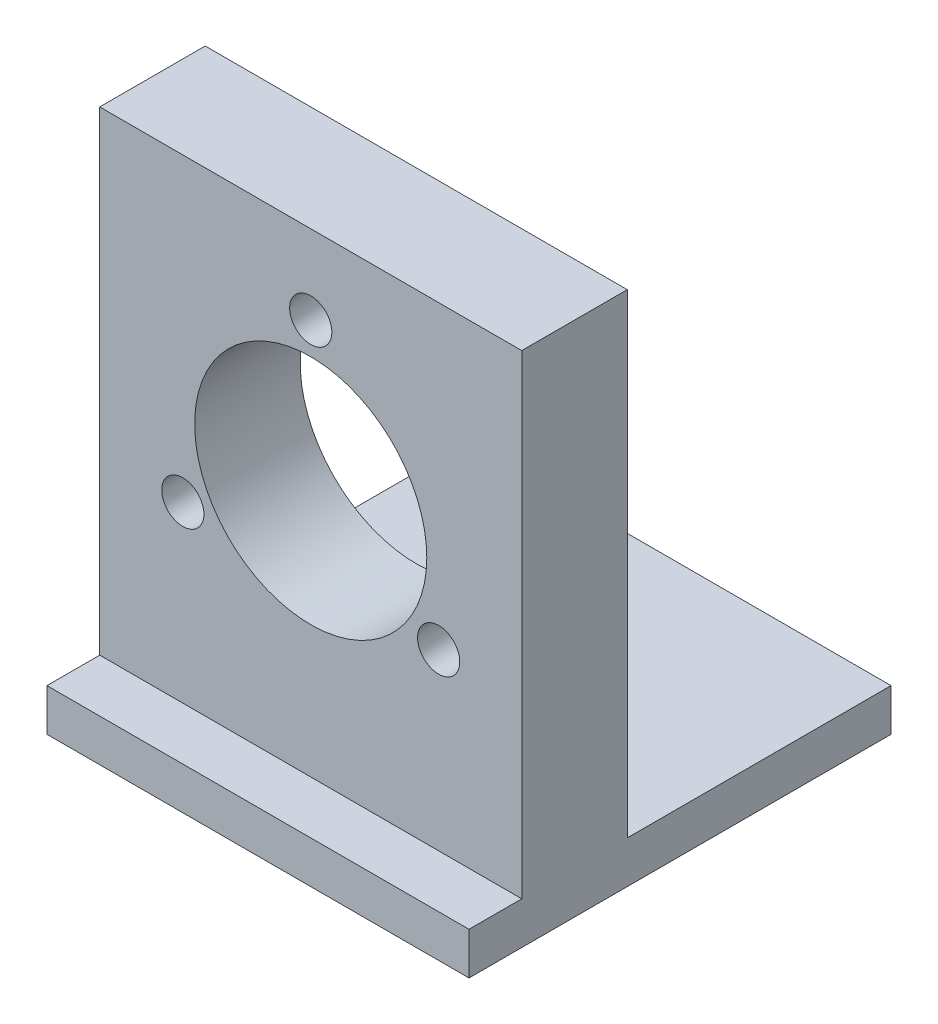
ISO-10303-21;
HEADER;
FILE_DESCRIPTION(('STEP AP214'),'2;1');
FILE_NAME('part.step','',(''),(''),'','','');
FILE_SCHEMA(('AUTOMOTIVE_DESIGN { 1 0 10303 214 1 1 1 1 }'));
ENDSEC;
DATA;
#1=APPLICATION_CONTEXT('core data for automotive mechanical design processes');
#2=APPLICATION_PROTOCOL_DEFINITION('international standard','automotive_design',2000,#1);
#3=PRODUCT_CONTEXT('',#1,'mechanical');
#4=PRODUCT('Part','Part','',(#3));
#5=PRODUCT_RELATED_PRODUCT_CATEGORY('part','',(#4));
#6=PRODUCT_DEFINITION_FORMATION('','',#4);
#7=PRODUCT_DEFINITION_CONTEXT('part definition',#1,'design');
#8=PRODUCT_DEFINITION('design','',#6,#7);
#9=PRODUCT_DEFINITION_SHAPE('','',#8);
#10=(LENGTH_UNIT() NAMED_UNIT(*) SI_UNIT(.MILLI.,.METRE.));
#11=(NAMED_UNIT(*) PLANE_ANGLE_UNIT() SI_UNIT($,.RADIAN.));
#12=(NAMED_UNIT(*) SI_UNIT($,.STERADIAN.) SOLID_ANGLE_UNIT());
#13=UNCERTAINTY_MEASURE_WITH_UNIT(LENGTH_MEASURE(1.E-05),#10,'distance_accuracy_value','');
#14=(GEOMETRIC_REPRESENTATION_CONTEXT(3) GLOBAL_UNCERTAINTY_ASSIGNED_CONTEXT((#13)) GLOBAL_UNIT_ASSIGNED_CONTEXT((#10,
#11,#12)) REPRESENTATION_CONTEXT('',''));
#15=CARTESIAN_POINT('',(0.,0.,0.));
#16=DIRECTION('',(0.,0.,1.));
#17=DIRECTION('',(1.,0.,0.));
#18=AXIS2_PLACEMENT_3D('',#15,#16,#17);
#19=CARTESIAN_POINT('',(0.,4.,0.));
#20=DIRECTION('',(0.,-1.,0.));
#21=DIRECTION('',(0.,0.,-1.));
#22=AXIS2_PLACEMENT_3D('',#19,#20,#21);
#23=PLANE('',#22);
#24=DIRECTION('',(-1.,0.,0.));
#25=VECTOR('',#24,1.);
#26=CARTESIAN_POINT('',(-12.2271510664455,4.,-0.794927437511903));
#27=LINE('',#26,#25);
#28=CARTESIAN_POINT('',(27.7728489335545,4.,-0.794927437511903));
#29=VERTEX_POINT('',#28);
#30=CARTESIAN_POINT('',(-12.2271510664455,4.,-0.794927437511903));
#31=VERTEX_POINT('',#30);
#32=EDGE_CURVE('E50',#29,#31,#27,.T.);
#33=ORIENTED_EDGE('',*,*,#32,.F.);
#34=DIRECTION('',(0.,0.,-1.));
#35=VECTOR('',#34,1.);
#36=CARTESIAN_POINT('',(27.7728489335545,4.,14.2050725624881));
#37=LINE('',#36,#35);
#38=CARTESIAN_POINT('',(27.7728489335545,4.,-25.7949274375119));
#39=VERTEX_POINT('',#38);
#40=EDGE_CURVE('E171',#29,#39,#37,.T.);
#41=ORIENTED_EDGE('',*,*,#40,.T.);
#42=DIRECTION('',(-1.,0.,0.));
#43=VECTOR('',#42,1.);
#44=CARTESIAN_POINT('',(-12.2271510664455,4.,-25.7949274375119));
#45=LINE('',#44,#43);
#46=CARTESIAN_POINT('',(-12.2271510664455,4.,-25.7949274375119));
#47=VERTEX_POINT('',#46);
#48=EDGE_CURVE('E161',#39,#47,#45,.T.);
#49=ORIENTED_EDGE('',*,*,#48,.T.);
#50=DIRECTION('',(0.,0.,1.));
#51=VECTOR('',#50,1.);
#52=CARTESIAN_POINT('',(-12.2271510664455,4.,14.2050725624881));
#53=LINE('',#52,#51);
#54=EDGE_CURVE('E151',#47,#31,#53,.T.);
#55=ORIENTED_EDGE('',*,*,#54,.T.);
#56=EDGE_LOOP('',(#33,#41,#49,#55));
#57=FACE_BOUND('',#56,.T.);
#58=ADVANCED_FACE('F33',(#57),#23,.F.);
#59=DIRECTION('',(1.,0.,0.));
#60=VECTOR('',#59,1.);
#61=CARTESIAN_POINT('',(-12.2271510664455,4.,9.2050725624881));
#62=LINE('',#61,#60);
#63=CARTESIAN_POINT('',(-12.2271510664455,4.,9.2050725624881));
#64=VERTEX_POINT('',#63);
#65=CARTESIAN_POINT('',(27.7728489335545,4.,9.2050725624881));
#66=VERTEX_POINT('',#65);
#67=EDGE_CURVE('E58',#64,#66,#62,.T.);
#68=ORIENTED_EDGE('',*,*,#67,.F.);
#69=CARTESIAN_POINT('',(-12.2271510664455,4.,14.2050725624881));
#70=VERTEX_POINT('',#69);
#71=EDGE_CURVE('E122',#64,#70,#53,.T.);
#72=ORIENTED_EDGE('',*,*,#71,.T.);
#73=DIRECTION('',(1.,0.,0.));
#74=VECTOR('',#73,1.);
#75=CARTESIAN_POINT('',(-12.2271510664455,4.,14.2050725624881));
#76=LINE('',#75,#74);
#77=CARTESIAN_POINT('',(27.7728489335545,4.,14.2050725624881));
#78=VERTEX_POINT('',#77);
#79=EDGE_CURVE('E145',#70,#78,#76,.T.);
#80=ORIENTED_EDGE('',*,*,#79,.T.);
#81=EDGE_CURVE('E167',#78,#66,#37,.T.);
#82=ORIENTED_EDGE('',*,*,#81,.T.);
#83=EDGE_LOOP('',(#68,#72,#80,#82));
#84=FACE_BOUND('',#83,.T.);
#85=ADVANCED_FACE('F177',(#84),#23,.F.);
#86=CARTESIAN_POINT('',(-12.2271510664455,4.,14.2050725624881));
#87=DIRECTION('',(1.,0.,0.));
#88=DIRECTION('',(0.,0.,-1.));
#89=AXIS2_PLACEMENT_3D('',#86,#87,#88);
#90=PLANE('',#89);
#91=DIRECTION('',(0.,0.,1.));
#92=VECTOR('',#91,1.);
#93=CARTESIAN_POINT('',(-12.2271510664455,0.,14.2050725624881));
#94=LINE('',#93,#92);
#95=CARTESIAN_POINT('',(-12.2271510664455,0.,-25.7949274375119));
#96=VERTEX_POINT('',#95);
#97=CARTESIAN_POINT('',(-12.2271510664455,0.,14.2050725624881));
#98=VERTEX_POINT('',#97);
#99=EDGE_CURVE('E123',#96,#98,#94,.T.);
#100=ORIENTED_EDGE('',*,*,#99,.T.);
#101=DIRECTION('',(0.,-1.,0.));
#102=VECTOR('',#101,1.);
#103=CARTESIAN_POINT('',(-12.2271510664455,4.,14.2050725624881));
#104=LINE('',#103,#102);
#105=EDGE_CURVE('E11',#70,#98,#104,.T.);
#106=ORIENTED_EDGE('',*,*,#105,.F.);
#107=ORIENTED_EDGE('',*,*,#71,.F.);
#108=DIRECTION('',(0.,-1.,0.));
#109=VECTOR('',#108,1.);
#110=CARTESIAN_POINT('',(-12.2271510664455,49.,9.2050725624881));
#111=LINE('',#110,#109);
#112=CARTESIAN_POINT('',(-12.2271510664455,49.,9.2050725624881));
#113=VERTEX_POINT('',#112);
#114=EDGE_CURVE('E104',#113,#64,#111,.T.);
#115=ORIENTED_EDGE('',*,*,#114,.F.);
#116=DIRECTION('',(0.,0.,1.));
#117=VECTOR('',#116,1.);
#118=CARTESIAN_POINT('',(-12.2271510664455,49.,-0.794927437511903));
#119=LINE('',#118,#117);
#120=CARTESIAN_POINT('',(-12.2271510664455,49.,-0.794927437511903));
#121=VERTEX_POINT('',#120);
#122=EDGE_CURVE('E110',#121,#113,#119,.T.);
#123=ORIENTED_EDGE('',*,*,#122,.F.);
#124=DIRECTION('',(0.,-1.,0.));
#125=VECTOR('',#124,1.);
#126=CARTESIAN_POINT('',(-12.2271510664455,49.,-0.794927437511903));
#127=LINE('',#126,#125);
#128=EDGE_CURVE('E136',#121,#31,#127,.T.);
#129=ORIENTED_EDGE('',*,*,#128,.T.);
#130=ORIENTED_EDGE('',*,*,#54,.F.);
#131=DIRECTION('',(0.,-1.,0.));
#132=VECTOR('',#131,1.);
#133=CARTESIAN_POINT('',(-12.2271510664455,4.,-25.7949274375119));
#134=LINE('',#133,#132);
#135=EDGE_CURVE('E158',#47,#96,#134,.T.);
#136=ORIENTED_EDGE('',*,*,#135,.T.);
#137=EDGE_LOOP('',(#100,#106,#107,#115,#123,#129,#130,#136));
#138=FACE_BOUND('',#137,.T.);
#139=ADVANCED_FACE('F35',(#138),#90,.F.);
#140=CARTESIAN_POINT('',(-12.2271510664455,4.,14.2050725624881));
#141=DIRECTION('',(0.,0.,-1.));
#142=DIRECTION('',(-1.,0.,0.));
#143=AXIS2_PLACEMENT_3D('',#140,#141,#142);
#144=PLANE('',#143);
#145=DIRECTION('',(1.,0.,0.));
#146=VECTOR('',#145,1.);
#147=CARTESIAN_POINT('',(-12.2271510664455,0.,14.2050725624881));
#148=LINE('',#147,#146);
#149=CARTESIAN_POINT('',(27.7728489335545,0.,14.2050725624881));
#150=VERTEX_POINT('',#149);
#151=EDGE_CURVE('E125',#98,#150,#148,.T.);
#152=ORIENTED_EDGE('',*,*,#151,.T.);
#153=DIRECTION('',(0.,-1.,0.));
#154=VECTOR('',#153,1.);
#155=CARTESIAN_POINT('',(27.7728489335545,4.,14.2050725624881));
#156=LINE('',#155,#154);
#157=EDGE_CURVE('E42',#78,#150,#156,.T.);
#158=ORIENTED_EDGE('',*,*,#157,.F.);
#159=ORIENTED_EDGE('',*,*,#79,.F.);
#160=ORIENTED_EDGE('',*,*,#105,.T.);
#161=EDGE_LOOP('',(#152,#158,#159,#160));
#162=FACE_BOUND('',#161,.T.);
#163=ADVANCED_FACE('F179',(#162),#144,.F.);
#164=CARTESIAN_POINT('',(27.7728489335545,4.,14.2050725624881));
#165=DIRECTION('',(-1.,0.,0.));
#166=DIRECTION('',(0.,0.,1.));
#167=AXIS2_PLACEMENT_3D('',#164,#165,#166);
#168=PLANE('',#167);
#169=DIRECTION('',(0.,0.,-1.));
#170=VECTOR('',#169,1.);
#171=CARTESIAN_POINT('',(27.7728489335545,0.,14.2050725624881));
#172=LINE('',#171,#170);
#173=CARTESIAN_POINT('',(27.7728489335545,0.,-25.7949274375119));
#174=VERTEX_POINT('',#173);
#175=EDGE_CURVE('E164',#150,#174,#172,.T.);
#176=ORIENTED_EDGE('',*,*,#175,.T.);
#177=DIRECTION('',(0.,-1.,0.));
#178=VECTOR('',#177,1.);
#179=CARTESIAN_POINT('',(27.7728489335545,4.,-25.7949274375119));
#180=LINE('',#179,#178);
#181=EDGE_CURVE('E155',#39,#174,#180,.T.);
#182=ORIENTED_EDGE('',*,*,#181,.F.);
#183=ORIENTED_EDGE('',*,*,#40,.F.);
#184=DIRECTION('',(0.,-1.,0.));
#185=VECTOR('',#184,1.);
#186=CARTESIAN_POINT('',(27.7728489335545,49.,-0.794927437511904));
#187=LINE('',#186,#185);
#188=CARTESIAN_POINT('',(27.7728489335545,49.,-0.794927437511904));
#189=VERTEX_POINT('',#188);
#190=EDGE_CURVE('E127',#189,#29,#187,.T.);
#191=ORIENTED_EDGE('',*,*,#190,.F.);
#192=DIRECTION('',(0.,0.,-1.));
#193=VECTOR('',#192,1.);
#194=CARTESIAN_POINT('',(27.7728489335545,49.,-0.794927437511904));
#195=LINE('',#194,#193);
#196=CARTESIAN_POINT('',(27.7728489335545,49.,9.2050725624881));
#197=VERTEX_POINT('',#196);
#198=EDGE_CURVE('E109',#197,#189,#195,.T.);
#199=ORIENTED_EDGE('',*,*,#198,.F.);
#200=DIRECTION('',(0.,-1.,0.));
#201=VECTOR('',#200,1.);
#202=CARTESIAN_POINT('',(27.7728489335545,49.,9.2050725624881));
#203=LINE('',#202,#201);
#204=EDGE_CURVE('E106',#197,#66,#203,.T.);
#205=ORIENTED_EDGE('',*,*,#204,.T.);
#206=ORIENTED_EDGE('',*,*,#81,.F.);
#207=ORIENTED_EDGE('',*,*,#157,.T.);
#208=EDGE_LOOP('',(#176,#182,#183,#191,#199,#205,#206,#207));
#209=FACE_BOUND('',#208,.T.);
#210=ADVANCED_FACE('F182',(#209),#168,.F.);
#211=CARTESIAN_POINT('',(-12.2271510664455,4.,-25.7949274375119));
#212=DIRECTION('',(0.,0.,1.));
#213=DIRECTION('',(1.,0.,0.));
#214=AXIS2_PLACEMENT_3D('',#211,#212,#213);
#215=PLANE('',#214);
#216=DIRECTION('',(-1.,0.,0.));
#217=VECTOR('',#216,1.);
#218=CARTESIAN_POINT('',(-12.2271510664455,0.,-25.7949274375119));
#219=LINE('',#218,#217);
#220=EDGE_CURVE('E162',#174,#96,#219,.T.);
#221=ORIENTED_EDGE('',*,*,#220,.T.);
#222=ORIENTED_EDGE('',*,*,#135,.F.);
#223=ORIENTED_EDGE('',*,*,#48,.F.);
#224=ORIENTED_EDGE('',*,*,#181,.T.);
#225=EDGE_LOOP('',(#221,#222,#223,#224));
#226=FACE_BOUND('',#225,.T.);
#227=ADVANCED_FACE('F243',(#226),#215,.F.);
#228=CARTESIAN_POINT('',(0.,0.,0.));
#229=DIRECTION('',(0.,-1.,0.));
#230=DIRECTION('',(0.,0.,-1.));
#231=AXIS2_PLACEMENT_3D('',#228,#229,#230);
#232=PLANE('',#231);
#233=ORIENTED_EDGE('',*,*,#99,.F.);
#234=ORIENTED_EDGE('',*,*,#220,.F.);
#235=ORIENTED_EDGE('',*,*,#175,.F.);
#236=ORIENTED_EDGE('',*,*,#151,.F.);
#237=EDGE_LOOP('',(#233,#234,#235,#236));
#238=FACE_BOUND('',#237,.T.);
#239=ADVANCED_FACE('F218',(#238),#232,.T.);
#240=CARTESIAN_POINT('',(-12.2271510664455,49.,9.2050725624881));
#241=DIRECTION('',(0.,0.,-1.));
#242=DIRECTION('',(-1.,0.,0.));
#243=AXIS2_PLACEMENT_3D('',#240,#241,#242);
#244=PLANE('',#243);
#245=CARTESIAN_POINT('',(7.77284893355455,41.5,9.2050725624881));
#246=DIRECTION('',(0.,0.,1.));
#247=DIRECTION('',(1.,0.,0.));
#248=AXIS2_PLACEMENT_3D('',#245,#246,#247);
#249=CIRCLE('',#248,2.00000000000001);
#250=CARTESIAN_POINT('',(9.77284893355455,41.5,9.2050725624881));
#251=VERTEX_POINT('',#250);
#252=EDGE_CURVE('E208',#251,#251,#249,.T.);
#253=ORIENTED_EDGE('',*,*,#252,.F.);
#254=EDGE_LOOP('',(#253));
#255=FACE_BOUND('',#254,.T.);
#256=CARTESIAN_POINT('',(-4.35150671942759,20.5,9.2050725624881));
#257=DIRECTION('',(0.,0.,1.));
#258=DIRECTION('',(1.,0.,0.));
#259=AXIS2_PLACEMENT_3D('',#256,#257,#258);
#260=CIRCLE('',#259,2.00000000000001);
#261=CARTESIAN_POINT('',(-2.35150671942758,20.5,9.2050725624881));
#262=VERTEX_POINT('',#261);
#263=EDGE_CURVE('E202',#262,#262,#260,.T.);
#264=ORIENTED_EDGE('',*,*,#263,.F.);
#265=EDGE_LOOP('',(#264));
#266=FACE_BOUND('',#265,.T.);
#267=CARTESIAN_POINT('',(19.8972045865367,20.5,9.2050725624881));
#268=DIRECTION('',(0.,0.,1.));
#269=DIRECTION('',(1.,0.,0.));
#270=AXIS2_PLACEMENT_3D('',#267,#268,#269);
#271=CIRCLE('',#270,2.00000000000001);
#272=CARTESIAN_POINT('',(21.8972045865367,20.5,9.2050725624881));
#273=VERTEX_POINT('',#272);
#274=EDGE_CURVE('E196',#273,#273,#271,.T.);
#275=ORIENTED_EDGE('',*,*,#274,.F.);
#276=EDGE_LOOP('',(#275));
#277=FACE_BOUND('',#276,.T.);
#278=CARTESIAN_POINT('',(7.77284893355455,27.5,9.2050725624881));
#279=DIRECTION('',(0.,0.,1.));
#280=DIRECTION('',(1.,0.,0.));
#281=AXIS2_PLACEMENT_3D('',#278,#279,#280);
#282=CIRCLE('',#281,11.);
#283=CARTESIAN_POINT('',(18.7728489335545,27.5,9.2050725624881));
#284=VERTEX_POINT('',#283);
#285=EDGE_CURVE('E190',#284,#284,#282,.T.);
#286=ORIENTED_EDGE('',*,*,#285,.F.);
#287=EDGE_LOOP('',(#286));
#288=FACE_BOUND('',#287,.T.);
#289=ORIENTED_EDGE('',*,*,#67,.T.);
#290=ORIENTED_EDGE('',*,*,#204,.F.);
#291=DIRECTION('',(1.,0.,0.));
#292=VECTOR('',#291,1.);
#293=CARTESIAN_POINT('',(-12.2271510664455,49.,9.2050725624881));
#294=LINE('',#293,#292);
#295=EDGE_CURVE('E100',#113,#197,#294,.T.);
#296=ORIENTED_EDGE('',*,*,#295,.F.);
#297=ORIENTED_EDGE('',*,*,#114,.T.);
#298=EDGE_LOOP('',(#289,#290,#296,#297));
#299=FACE_BOUND('',#298,.T.);
#300=ADVANCED_FACE('F102',(#255,#266,#277,#288,#299),#244,.F.);
#301=CARTESIAN_POINT('',(-12.2271510664455,49.,-0.794927437511903));
#302=DIRECTION('',(0.,0.,1.));
#303=DIRECTION('',(1.,0.,0.));
#304=AXIS2_PLACEMENT_3D('',#301,#302,#303);
#305=PLANE('',#304);
#306=CARTESIAN_POINT('',(7.77284893355455,41.5,-0.794927437511903));
#307=DIRECTION('',(0.,0.,1.));
#308=DIRECTION('',(1.,0.,0.));
#309=AXIS2_PLACEMENT_3D('',#306,#307,#308);
#310=CIRCLE('',#309,2.00000000000001);
#311=CARTESIAN_POINT('',(9.77284893355455,41.5,-0.794927437511903));
#312=VERTEX_POINT('',#311);
#313=EDGE_CURVE('E205',#312,#312,#310,.F.);
#314=ORIENTED_EDGE('',*,*,#313,.F.);
#315=EDGE_LOOP('',(#314));
#316=FACE_BOUND('',#315,.T.);
#317=CARTESIAN_POINT('',(-4.35150671942759,20.5,-0.794927437511903));
#318=DIRECTION('',(0.,0.,1.));
#319=DIRECTION('',(1.,0.,0.));
#320=AXIS2_PLACEMENT_3D('',#317,#318,#319);
#321=CIRCLE('',#320,2.00000000000001);
#322=CARTESIAN_POINT('',(-2.35150671942758,20.5,-0.794927437511903));
#323=VERTEX_POINT('',#322);
#324=EDGE_CURVE('E199',#323,#323,#321,.F.);
#325=ORIENTED_EDGE('',*,*,#324,.F.);
#326=EDGE_LOOP('',(#325));
#327=FACE_BOUND('',#326,.T.);
#328=CARTESIAN_POINT('',(19.8972045865367,20.5,-0.794927437511903));
#329=DIRECTION('',(0.,0.,1.));
#330=DIRECTION('',(1.,0.,0.));
#331=AXIS2_PLACEMENT_3D('',#328,#329,#330);
#332=CIRCLE('',#331,2.00000000000001);
#333=CARTESIAN_POINT('',(21.8972045865367,20.5,-0.794927437511903));
#334=VERTEX_POINT('',#333);
#335=EDGE_CURVE('E193',#334,#334,#332,.F.);
#336=ORIENTED_EDGE('',*,*,#335,.F.);
#337=EDGE_LOOP('',(#336));
#338=FACE_BOUND('',#337,.T.);
#339=CARTESIAN_POINT('',(7.77284893355455,27.5,-0.794927437511903));
#340=DIRECTION('',(0.,0.,1.));
#341=DIRECTION('',(1.,0.,0.));
#342=AXIS2_PLACEMENT_3D('',#339,#340,#341);
#343=CIRCLE('',#342,11.);
#344=CARTESIAN_POINT('',(18.7728489335545,27.5,-0.794927437511903));
#345=VERTEX_POINT('',#344);
#346=EDGE_CURVE('E187',#345,#345,#343,.F.);
#347=ORIENTED_EDGE('',*,*,#346,.F.);
#348=EDGE_LOOP('',(#347));
#349=FACE_BOUND('',#348,.T.);
#350=ORIENTED_EDGE('',*,*,#32,.T.);
#351=ORIENTED_EDGE('',*,*,#128,.F.);
#352=DIRECTION('',(-1.,0.,0.));
#353=VECTOR('',#352,1.);
#354=CARTESIAN_POINT('',(-12.2271510664455,49.,-0.794927437511903));
#355=LINE('',#354,#353);
#356=EDGE_CURVE('E115',#189,#121,#355,.T.);
#357=ORIENTED_EDGE('',*,*,#356,.F.);
#358=ORIENTED_EDGE('',*,*,#190,.T.);
#359=EDGE_LOOP('',(#350,#351,#357,#358));
#360=FACE_BOUND('',#359,.T.);
#361=ADVANCED_FACE('F217',(#316,#327,#338,#349,#360),#305,.F.);
#362=CARTESIAN_POINT('',(0.,49.,0.));
#363=DIRECTION('',(0.,1.,0.));
#364=DIRECTION('',(0.,0.,1.));
#365=AXIS2_PLACEMENT_3D('',#362,#363,#364);
#366=PLANE('',#365);
#367=ORIENTED_EDGE('',*,*,#122,.T.);
#368=ORIENTED_EDGE('',*,*,#295,.T.);
#369=ORIENTED_EDGE('',*,*,#198,.T.);
#370=ORIENTED_EDGE('',*,*,#356,.T.);
#371=EDGE_LOOP('',(#367,#368,#369,#370));
#372=FACE_BOUND('',#371,.T.);
#373=ADVANCED_FACE('F113',(#372),#366,.T.);
#374=CARTESIAN_POINT('',(7.77284893355455,27.5,-25.7959524375119));
#375=DIRECTION('',(0.,0.,1.));
#376=DIRECTION('',(1.,0.,0.));
#377=AXIS2_PLACEMENT_3D('',#374,#375,#376);
#378=CYLINDRICAL_SURFACE('',#377,11.);
#379=ORIENTED_EDGE('',*,*,#285,.T.);
#380=EDGE_LOOP('',(#379));
#381=FACE_BOUND('',#380,.T.);
#382=ORIENTED_EDGE('',*,*,#346,.T.);
#383=EDGE_LOOP('',(#382));
#384=FACE_BOUND('',#383,.T.);
#385=ADVANCED_FACE('F226',(#381,#384),#378,.F.);
#386=CARTESIAN_POINT('',(19.8972045865367,20.5,-25.7959524375119));
#387=DIRECTION('',(0.,0.,1.));
#388=DIRECTION('',(1.,0.,0.));
#389=AXIS2_PLACEMENT_3D('',#386,#387,#388);
#390=CYLINDRICAL_SURFACE('',#389,2.00000000000001);
#391=ORIENTED_EDGE('',*,*,#274,.T.);
#392=EDGE_LOOP('',(#391));
#393=FACE_BOUND('',#392,.T.);
#394=ORIENTED_EDGE('',*,*,#335,.T.);
#395=EDGE_LOOP('',(#394));
#396=FACE_BOUND('',#395,.T.);
#397=ADVANCED_FACE('F229',(#393,#396),#390,.F.);
#398=CARTESIAN_POINT('',(-4.35150671942759,20.5,-25.7959524375119));
#399=DIRECTION('',(0.,0.,1.));
#400=DIRECTION('',(1.,0.,0.));
#401=AXIS2_PLACEMENT_3D('',#398,#399,#400);
#402=CYLINDRICAL_SURFACE('',#401,2.00000000000001);
#403=ORIENTED_EDGE('',*,*,#263,.T.);
#404=EDGE_LOOP('',(#403));
#405=FACE_BOUND('',#404,.T.);
#406=ORIENTED_EDGE('',*,*,#324,.T.);
#407=EDGE_LOOP('',(#406));
#408=FACE_BOUND('',#407,.T.);
#409=ADVANCED_FACE('F262',(#405,#408),#402,.F.);
#410=CARTESIAN_POINT('',(7.77284893355455,41.5,-25.7959524375119));
#411=DIRECTION('',(0.,0.,1.));
#412=DIRECTION('',(1.,0.,0.));
#413=AXIS2_PLACEMENT_3D('',#410,#411,#412);
#414=CYLINDRICAL_SURFACE('',#413,2.00000000000001);
#415=ORIENTED_EDGE('',*,*,#252,.T.);
#416=EDGE_LOOP('',(#415));
#417=FACE_BOUND('',#416,.T.);
#418=ORIENTED_EDGE('',*,*,#313,.T.);
#419=EDGE_LOOP('',(#418));
#420=FACE_BOUND('',#419,.T.);
#421=ADVANCED_FACE('F212',(#417,#420),#414,.F.);
#422=CLOSED_SHELL('',(#58,#85,#139,#163,#210,#227,#239,#300,#361,#373,#385,#397,#409,#421));
#423=MANIFOLD_SOLID_BREP('B2',#422);
#424=ADVANCED_BREP_SHAPE_REPRESENTATION('',(#18,#423),#14);
#425=SHAPE_DEFINITION_REPRESENTATION(#9,#424);
ENDSEC;
END-ISO-10303-21;
